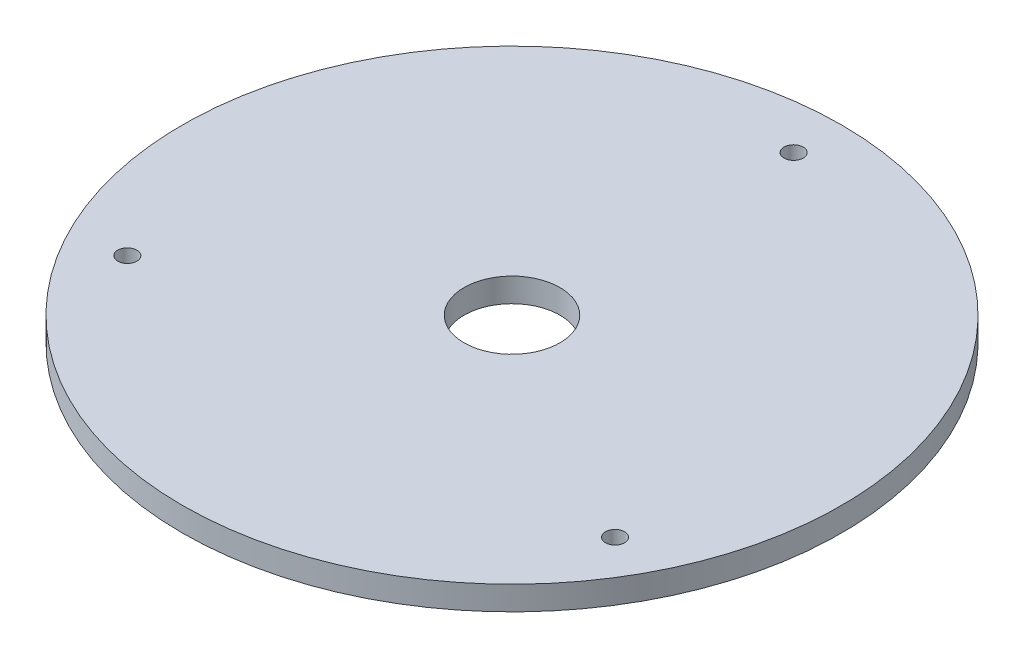
ISO-10303-21;
HEADER;
FILE_DESCRIPTION(('STEP AP214'),'2;1');
FILE_NAME('part.step','',(''),(''),'','','');
FILE_SCHEMA(('AUTOMOTIVE_DESIGN { 1 0 10303 214 1 1 1 1 }'));
ENDSEC;
DATA;
#1=APPLICATION_CONTEXT('core data for automotive mechanical design processes');
#2=APPLICATION_PROTOCOL_DEFINITION('international standard','automotive_design',2000,#1);
#3=PRODUCT_CONTEXT('',#1,'mechanical');
#4=PRODUCT('Part','Part','',(#3));
#5=PRODUCT_RELATED_PRODUCT_CATEGORY('part','',(#4));
#6=PRODUCT_DEFINITION_FORMATION('','',#4);
#7=PRODUCT_DEFINITION_CONTEXT('part definition',#1,'design');
#8=PRODUCT_DEFINITION('design','',#6,#7);
#9=PRODUCT_DEFINITION_SHAPE('','',#8);
#10=(LENGTH_UNIT() NAMED_UNIT(*) SI_UNIT(.MILLI.,.METRE.));
#11=(NAMED_UNIT(*) PLANE_ANGLE_UNIT() SI_UNIT($,.RADIAN.));
#12=(NAMED_UNIT(*) SI_UNIT($,.STERADIAN.) SOLID_ANGLE_UNIT());
#13=UNCERTAINTY_MEASURE_WITH_UNIT(LENGTH_MEASURE(1.E-05),#10,'distance_accuracy_value','');
#14=(GEOMETRIC_REPRESENTATION_CONTEXT(3) GLOBAL_UNCERTAINTY_ASSIGNED_CONTEXT((#13)) GLOBAL_UNIT_ASSIGNED_CONTEXT((#10,
#11,#12)) REPRESENTATION_CONTEXT('',''));
#15=CARTESIAN_POINT('',(0.,0.,0.));
#16=DIRECTION('',(0.,0.,1.));
#17=DIRECTION('',(1.,0.,0.));
#18=AXIS2_PLACEMENT_3D('',#15,#16,#17);
#19=CARTESIAN_POINT('',(0.,4.,0.));
#20=DIRECTION('',(0.,-1.,0.));
#21=DIRECTION('',(0.,0.,-1.));
#22=AXIS2_PLACEMENT_3D('',#19,#20,#21);
#23=CYLINDRICAL_SURFACE('',#22,55.);
#24=CARTESIAN_POINT('',(0.,4.,0.));
#25=DIRECTION('',(0.,1.,0.));
#26=DIRECTION('',(0.,0.,1.));
#27=AXIS2_PLACEMENT_3D('',#24,#25,#26);
#28=CIRCLE('',#27,55.);
#29=CARTESIAN_POINT('',(0.,4.,55.));
#30=VERTEX_POINT('',#29);
#31=EDGE_CURVE('E10',#30,#30,#28,.T.);
#32=ORIENTED_EDGE('',*,*,#31,.F.);
#33=EDGE_LOOP('',(#32));
#34=FACE_BOUND('',#33,.T.);
#35=CARTESIAN_POINT('',(0.,0.,0.));
#36=DIRECTION('',(0.,1.,0.));
#37=DIRECTION('',(0.,0.,1.));
#38=AXIS2_PLACEMENT_3D('',#35,#36,#37);
#39=CIRCLE('',#38,55.);
#40=CARTESIAN_POINT('',(0.,0.,55.));
#41=VERTEX_POINT('',#40);
#42=EDGE_CURVE('E37',#41,#41,#39,.T.);
#43=ORIENTED_EDGE('',*,*,#42,.T.);
#44=EDGE_LOOP('',(#43));
#45=FACE_BOUND('',#44,.T.);
#46=ADVANCED_FACE('F40',(#34,#45),#23,.T.);
#47=CARTESIAN_POINT('',(0.,4.,0.));
#48=DIRECTION('',(0.,1.,0.));
#49=DIRECTION('',(0.,0.,1.));
#50=AXIS2_PLACEMENT_3D('',#47,#48,#49);
#51=PLANE('',#50);
#52=CARTESIAN_POINT('',(-40.7031939778656,4.,23.5000000000017));
#53=DIRECTION('',(0.,1.,0.));
#54=DIRECTION('',(0.,0.,1.));
#55=AXIS2_PLACEMENT_3D('',#52,#53,#54);
#56=CIRCLE('',#55,1.60000000000376);
#57=CARTESIAN_POINT('',(-40.7031939778656,4.,25.1000000000055));
#58=VERTEX_POINT('',#57);
#59=EDGE_CURVE('E59',#58,#58,#56,.T.);
#60=ORIENTED_EDGE('',*,*,#59,.F.);
#61=EDGE_LOOP('',(#60));
#62=FACE_BOUND('',#61,.T.);
#63=CARTESIAN_POINT('',(40.7031939778716,4.,23.4999999999983));
#64=DIRECTION('',(0.,1.,0.));
#65=DIRECTION('',(0.,0.,1.));
#66=AXIS2_PLACEMENT_3D('',#63,#64,#65);
#67=CIRCLE('',#66,1.60000000000257);
#68=CARTESIAN_POINT('',(40.7031939778716,4.,25.1000000000008));
#69=VERTEX_POINT('',#68);
#70=EDGE_CURVE('E64',#69,#69,#67,.T.);
#71=ORIENTED_EDGE('',*,*,#70,.F.);
#72=EDGE_LOOP('',(#71));
#73=FACE_BOUND('',#72,.T.);
#74=CARTESIAN_POINT('',(0.,4.,-47.));
#75=DIRECTION('',(0.,1.,0.));
#76=DIRECTION('',(0.,0.,1.));
#77=AXIS2_PLACEMENT_3D('',#74,#75,#76);
#78=CIRCLE('',#77,1.6);
#79=CARTESIAN_POINT('',(0.,4.,-45.4));
#80=VERTEX_POINT('',#79);
#81=EDGE_CURVE('E55',#80,#80,#78,.T.);
#82=ORIENTED_EDGE('',*,*,#81,.F.);
#83=EDGE_LOOP('',(#82));
#84=FACE_BOUND('',#83,.T.);
#85=CARTESIAN_POINT('',(0.,4.,0.));
#86=DIRECTION('',(0.,1.,0.));
#87=DIRECTION('',(0.,0.,1.));
#88=AXIS2_PLACEMENT_3D('',#85,#86,#87);
#89=CIRCLE('',#88,8.);
#90=CARTESIAN_POINT('',(0.,4.,8.));
#91=VERTEX_POINT('',#90);
#92=EDGE_CURVE('E47',#91,#91,#89,.T.);
#93=ORIENTED_EDGE('',*,*,#92,.F.);
#94=EDGE_LOOP('',(#93));
#95=FACE_BOUND('',#94,.T.);
#96=ORIENTED_EDGE('',*,*,#31,.T.);
#97=EDGE_LOOP('',(#96));
#98=FACE_BOUND('',#97,.T.);
#99=ADVANCED_FACE('F71',(#62,#73,#84,#95,#98),#51,.T.);
#100=CARTESIAN_POINT('',(0.,0.,0.));
#101=DIRECTION('',(0.,1.,0.));
#102=DIRECTION('',(0.,0.,1.));
#103=AXIS2_PLACEMENT_3D('',#100,#101,#102);
#104=PLANE('',#103);
#105=CARTESIAN_POINT('',(-40.7031939778656,0.,23.5000000000017));
#106=DIRECTION('',(0.,1.,0.));
#107=DIRECTION('',(0.,0.,1.));
#108=AXIS2_PLACEMENT_3D('',#105,#106,#107);
#109=CIRCLE('',#108,1.60000000000376);
#110=CARTESIAN_POINT('',(-40.7031939778656,0.,25.1000000000055));
#111=VERTEX_POINT('',#110);
#112=EDGE_CURVE('E54',#111,#111,#109,.T.);
#113=ORIENTED_EDGE('',*,*,#112,.T.);
#114=EDGE_LOOP('',(#113));
#115=FACE_BOUND('',#114,.T.);
#116=CARTESIAN_POINT('',(40.7031939778716,0.,23.4999999999983));
#117=DIRECTION('',(0.,1.,0.));
#118=DIRECTION('',(0.,0.,1.));
#119=AXIS2_PLACEMENT_3D('',#116,#117,#118);
#120=CIRCLE('',#119,1.60000000000257);
#121=CARTESIAN_POINT('',(40.7031939778716,0.,25.1000000000008));
#122=VERTEX_POINT('',#121);
#123=EDGE_CURVE('E62',#122,#122,#120,.T.);
#124=ORIENTED_EDGE('',*,*,#123,.T.);
#125=EDGE_LOOP('',(#124));
#126=FACE_BOUND('',#125,.T.);
#127=CARTESIAN_POINT('',(0.,0.,-47.));
#128=DIRECTION('',(0.,1.,0.));
#129=DIRECTION('',(0.,0.,1.));
#130=AXIS2_PLACEMENT_3D('',#127,#128,#129);
#131=CIRCLE('',#130,1.6);
#132=CARTESIAN_POINT('',(0.,0.,-45.4));
#133=VERTEX_POINT('',#132);
#134=EDGE_CURVE('E70',#133,#133,#131,.T.);
#135=ORIENTED_EDGE('',*,*,#134,.T.);
#136=EDGE_LOOP('',(#135));
#137=FACE_BOUND('',#136,.T.);
#138=CARTESIAN_POINT('',(0.,0.,0.));
#139=DIRECTION('',(0.,1.,0.));
#140=DIRECTION('',(0.,0.,1.));
#141=AXIS2_PLACEMENT_3D('',#138,#139,#140);
#142=CIRCLE('',#141,8.);
#143=CARTESIAN_POINT('',(0.,0.,8.));
#144=VERTEX_POINT('',#143);
#145=EDGE_CURVE('E50',#144,#144,#142,.T.);
#146=ORIENTED_EDGE('',*,*,#145,.T.);
#147=EDGE_LOOP('',(#146));
#148=FACE_BOUND('',#147,.T.);
#149=ORIENTED_EDGE('',*,*,#42,.F.);
#150=EDGE_LOOP('',(#149));
#151=FACE_BOUND('',#150,.T.);
#152=ADVANCED_FACE('F76',(#115,#126,#137,#148,#151),#104,.F.);
#153=CARTESIAN_POINT('',(0.,0.,0.));
#154=DIRECTION('',(0.,1.,0.));
#155=DIRECTION('',(0.,0.,1.));
#156=AXIS2_PLACEMENT_3D('',#153,#154,#155);
#157=CYLINDRICAL_SURFACE('',#156,8.);
#158=ORIENTED_EDGE('',*,*,#145,.F.);
#159=EDGE_LOOP('',(#158));
#160=FACE_BOUND('',#159,.T.);
#161=ORIENTED_EDGE('',*,*,#92,.T.);
#162=EDGE_LOOP('',(#161));
#163=FACE_BOUND('',#162,.T.);
#164=ADVANCED_FACE('F81',(#160,#163),#157,.F.);
#165=CARTESIAN_POINT('',(0.,0.,-47.));
#166=DIRECTION('',(0.,1.,0.));
#167=DIRECTION('',(0.,0.,1.));
#168=AXIS2_PLACEMENT_3D('',#165,#166,#167);
#169=CYLINDRICAL_SURFACE('',#168,1.6);
#170=ORIENTED_EDGE('',*,*,#134,.F.);
#171=EDGE_LOOP('',(#170));
#172=FACE_BOUND('',#171,.T.);
#173=ORIENTED_EDGE('',*,*,#81,.T.);
#174=EDGE_LOOP('',(#173));
#175=FACE_BOUND('',#174,.T.);
#176=ADVANCED_FACE('F73',(#172,#175),#169,.F.);
#177=CARTESIAN_POINT('',(40.7031939778716,0.,23.4999999999983));
#178=DIRECTION('',(0.,1.,0.));
#179=DIRECTION('',(0.,0.,1.));
#180=AXIS2_PLACEMENT_3D('',#177,#178,#179);
#181=CYLINDRICAL_SURFACE('',#180,1.60000000000257);
#182=ORIENTED_EDGE('',*,*,#123,.F.);
#183=EDGE_LOOP('',(#182));
#184=FACE_BOUND('',#183,.T.);
#185=ORIENTED_EDGE('',*,*,#70,.T.);
#186=EDGE_LOOP('',(#185));
#187=FACE_BOUND('',#186,.T.);
#188=ADVANCED_FACE('F91',(#184,#187),#181,.F.);
#189=CARTESIAN_POINT('',(-40.7031939778656,0.,23.5000000000017));
#190=DIRECTION('',(0.,1.,0.));
#191=DIRECTION('',(0.,0.,1.));
#192=AXIS2_PLACEMENT_3D('',#189,#190,#191);
#193=CYLINDRICAL_SURFACE('',#192,1.60000000000376);
#194=ORIENTED_EDGE('',*,*,#112,.F.);
#195=EDGE_LOOP('',(#194));
#196=FACE_BOUND('',#195,.T.);
#197=ORIENTED_EDGE('',*,*,#59,.T.);
#198=EDGE_LOOP('',(#197));
#199=FACE_BOUND('',#198,.T.);
#200=ADVANCED_FACE('F132',(#196,#199),#193,.F.);
#201=CLOSED_SHELL('',(#46,#99,#152,#164,#176,#188,#200));
#202=MANIFOLD_SOLID_BREP('B2',#201);
#203=ADVANCED_BREP_SHAPE_REPRESENTATION('',(#18,#202),#14);
#204=SHAPE_DEFINITION_REPRESENTATION(#9,#203);
ENDSEC;
END-ISO-10303-21;
